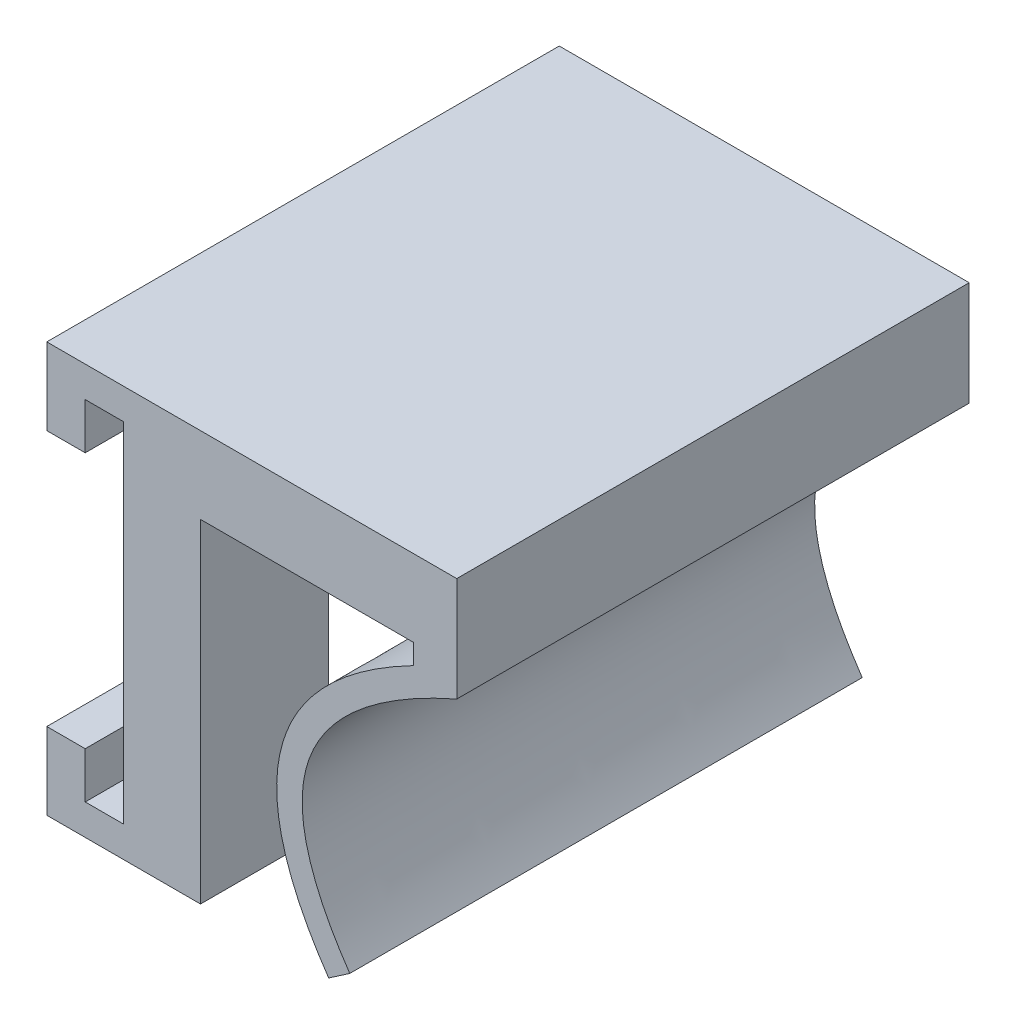
ISO-10303-21;
HEADER;
FILE_DESCRIPTION(('STEP AP214'),'2;1');
FILE_NAME('part.step','',(''),(''),'','','');
FILE_SCHEMA(('AUTOMOTIVE_DESIGN { 1 0 10303 214 1 1 1 1 }'));
ENDSEC;
DATA;
#1=APPLICATION_CONTEXT('core data for automotive mechanical design processes');
#2=APPLICATION_PROTOCOL_DEFINITION('international standard','automotive_design',2000,#1);
#3=PRODUCT_CONTEXT('',#1,'mechanical');
#4=PRODUCT('Part','Part','',(#3));
#5=PRODUCT_RELATED_PRODUCT_CATEGORY('part','',(#4));
#6=PRODUCT_DEFINITION_FORMATION('','',#4);
#7=PRODUCT_DEFINITION_CONTEXT('part definition',#1,'design');
#8=PRODUCT_DEFINITION('design','',#6,#7);
#9=PRODUCT_DEFINITION_SHAPE('','',#8);
#10=(LENGTH_UNIT() NAMED_UNIT(*) SI_UNIT(.MILLI.,.METRE.));
#11=(NAMED_UNIT(*) PLANE_ANGLE_UNIT() SI_UNIT($,.RADIAN.));
#12=(NAMED_UNIT(*) SI_UNIT($,.STERADIAN.) SOLID_ANGLE_UNIT());
#13=UNCERTAINTY_MEASURE_WITH_UNIT(LENGTH_MEASURE(1.E-05),#10,'distance_accuracy_value','');
#14=(GEOMETRIC_REPRESENTATION_CONTEXT(3) GLOBAL_UNCERTAINTY_ASSIGNED_CONTEXT((#13)) GLOBAL_UNIT_ASSIGNED_CONTEXT((#10,
#11,#12)) REPRESENTATION_CONTEXT('',''));
#15=CARTESIAN_POINT('',(0.,0.,0.));
#16=DIRECTION('',(0.,0.,1.));
#17=DIRECTION('',(1.,0.,0.));
#18=AXIS2_PLACEMENT_3D('',#15,#16,#17);
#19=CARTESIAN_POINT('',(0.,-8.,20.));
#20=DIRECTION('',(0.,1.,0.));
#21=DIRECTION('',(0.,0.,1.));
#22=AXIS2_PLACEMENT_3D('',#19,#20,#21);
#23=PLANE('',#22);
#24=DIRECTION('',(0.,0.,1.));
#25=VECTOR('',#24,1.);
#26=CARTESIAN_POINT('',(-4.5,-8.,0.));
#27=LINE('',#26,#25);
#28=CARTESIAN_POINT('',(-4.5,-8.,15.));
#29=VERTEX_POINT('',#28);
#30=CARTESIAN_POINT('',(-4.5,-8.,20.));
#31=VERTEX_POINT('',#30);
#32=EDGE_CURVE('E437',#29,#31,#27,.T.);
#33=ORIENTED_EDGE('',*,*,#32,.F.);
#34=DIRECTION('',(-1.,0.,0.));
#35=VECTOR('',#34,1.);
#36=CARTESIAN_POINT('',(1.5,-8.,15.));
#37=LINE('',#36,#35);
#38=CARTESIAN_POINT('',(1.5,-8.,15.));
#39=VERTEX_POINT('',#38);
#40=EDGE_CURVE('E239',#39,#29,#37,.T.);
#41=ORIENTED_EDGE('',*,*,#40,.F.);
#42=DIRECTION('',(0.,0.,-1.));
#43=VECTOR('',#42,1.);
#44=CARTESIAN_POINT('',(1.5,-8.,20.));
#45=LINE('',#44,#43);
#46=CARTESIAN_POINT('',(1.5,-8.,20.));
#47=VERTEX_POINT('',#46);
#48=EDGE_CURVE('E245',#47,#39,#45,.T.);
#49=ORIENTED_EDGE('',*,*,#48,.F.);
#50=DIRECTION('',(1.,0.,0.));
#51=VECTOR('',#50,1.);
#52=CARTESIAN_POINT('',(0.,-8.,20.));
#53=LINE('',#52,#51);
#54=EDGE_CURVE('E306',#31,#47,#53,.T.);
#55=ORIENTED_EDGE('',*,*,#54,.F.);
#56=EDGE_LOOP('',(#33,#41,#49,#55));
#57=FACE_BOUND('',#56,.T.);
#58=ADVANCED_FACE('F35',(#57),#23,.F.);
#59=CARTESIAN_POINT('',(1.5,0.,20.));
#60=DIRECTION('',(-1.,0.,0.));
#61=DIRECTION('',(0.,-1.,0.));
#62=AXIS2_PLACEMENT_3D('',#59,#60,#61);
#63=PLANE('',#62);
#64=ORIENTED_EDGE('',*,*,#48,.T.);
#65=DIRECTION('',(0.,1.,0.));
#66=VECTOR('',#65,1.);
#67=CARTESIAN_POINT('',(1.5,0.,15.));
#68=LINE('',#67,#66);
#69=CARTESIAN_POINT('',(1.5,5.,15.));
#70=VERTEX_POINT('',#69);
#71=EDGE_CURVE('E228',#39,#70,#68,.T.);
#72=ORIENTED_EDGE('',*,*,#71,.T.);
#73=DIRECTION('',(0.,0.,-1.));
#74=VECTOR('',#73,1.);
#75=CARTESIAN_POINT('',(1.5,5.,20.));
#76=LINE('',#75,#74);
#77=CARTESIAN_POINT('',(1.5,5.,20.));
#78=VERTEX_POINT('',#77);
#79=EDGE_CURVE('E246',#78,#70,#76,.T.);
#80=ORIENTED_EDGE('',*,*,#79,.F.);
#81=DIRECTION('',(0.,1.,0.));
#82=VECTOR('',#81,1.);
#83=CARTESIAN_POINT('',(1.5,0.,20.));
#84=LINE('',#83,#82);
#85=EDGE_CURVE('E301',#47,#78,#84,.T.);
#86=ORIENTED_EDGE('',*,*,#85,.F.);
#87=EDGE_LOOP('',(#64,#72,#80,#86));
#88=FACE_BOUND('',#87,.T.);
#89=ADVANCED_FACE('F554',(#88),#63,.F.);
#90=CARTESIAN_POINT('',(-4.5,-5.,0.));
#91=DIRECTION('',(0.,-1.,0.));
#92=DIRECTION('',(0.,0.,-1.));
#93=AXIS2_PLACEMENT_3D('',#90,#91,#92);
#94=PLANE('',#93);
#95=DIRECTION('',(0.,0.,1.));
#96=VECTOR('',#95,1.);
#97=CARTESIAN_POINT('',(-3.,-5.,20.));
#98=LINE('',#97,#96);
#99=CARTESIAN_POINT('',(-3.,-5.,15.));
#100=VERTEX_POINT('',#99);
#101=CARTESIAN_POINT('',(-3.,-5.,20.));
#102=VERTEX_POINT('',#101);
#103=EDGE_CURVE('E502',#100,#102,#98,.T.);
#104=ORIENTED_EDGE('',*,*,#103,.F.);
#105=DIRECTION('',(-1.,0.,0.));
#106=VECTOR('',#105,1.);
#107=CARTESIAN_POINT('',(1.5,-5.,15.));
#108=LINE('',#107,#106);
#109=CARTESIAN_POINT('',(-4.5,-5.,15.));
#110=VERTEX_POINT('',#109);
#111=EDGE_CURVE('E511',#100,#110,#108,.T.);
#112=ORIENTED_EDGE('',*,*,#111,.T.);
#113=DIRECTION('',(0.,0.,-1.));
#114=VECTOR('',#113,1.);
#115=CARTESIAN_POINT('',(-4.5,-5.,0.));
#116=LINE('',#115,#114);
#117=CARTESIAN_POINT('',(-4.5,-5.,20.));
#118=VERTEX_POINT('',#117);
#119=EDGE_CURVE('E443',#118,#110,#116,.T.);
#120=ORIENTED_EDGE('',*,*,#119,.F.);
#121=DIRECTION('',(1.,0.,0.));
#122=VECTOR('',#121,1.);
#123=CARTESIAN_POINT('',(-4.5,-5.,20.));
#124=LINE('',#123,#122);
#125=EDGE_CURVE('E449',#118,#102,#124,.T.);
#126=ORIENTED_EDGE('',*,*,#125,.T.);
#127=EDGE_LOOP('',(#104,#112,#120,#126));
#128=FACE_BOUND('',#127,.T.);
#129=ADVANCED_FACE('F560',(#128),#94,.F.);
#130=CARTESIAN_POINT('',(-4.5,0.,0.));
#131=DIRECTION('',(1.,0.,0.));
#132=DIRECTION('',(0.,0.,-1.));
#133=AXIS2_PLACEMENT_3D('',#130,#131,#132);
#134=PLANE('',#133);
#135=ORIENTED_EDGE('',*,*,#119,.T.);
#136=DIRECTION('',(0.,1.,0.));
#137=VECTOR('',#136,1.);
#138=CARTESIAN_POINT('',(-4.5,-8.,15.));
#139=LINE('',#138,#137);
#140=EDGE_CURVE('E512',#29,#110,#139,.T.);
#141=ORIENTED_EDGE('',*,*,#140,.F.);
#142=ORIENTED_EDGE('',*,*,#32,.T.);
#143=DIRECTION('',(0.,1.,0.));
#144=VECTOR('',#143,1.);
#145=CARTESIAN_POINT('',(-4.5,-8.,20.));
#146=LINE('',#145,#144);
#147=EDGE_CURVE('E440',#31,#118,#146,.T.);
#148=ORIENTED_EDGE('',*,*,#147,.T.);
#149=EDGE_LOOP('',(#135,#141,#142,#148));
#150=FACE_BOUND('',#149,.T.);
#151=ADVANCED_FACE('F552',(#150),#134,.F.);
#152=CARTESIAN_POINT('',(-3.,-6.8,20.));
#153=DIRECTION('',(-1.,0.,0.));
#154=DIRECTION('',(0.,0.,1.));
#155=AXIS2_PLACEMENT_3D('',#152,#153,#154);
#156=PLANE('',#155);
#157=DIRECTION('',(0.,0.,1.));
#158=VECTOR('',#157,1.);
#159=CARTESIAN_POINT('',(-3.,-6.8,20.));
#160=LINE('',#159,#158);
#161=CARTESIAN_POINT('',(-3.,-6.8,15.));
#162=VERTEX_POINT('',#161);
#163=CARTESIAN_POINT('',(-3.,-6.8,20.));
#164=VERTEX_POINT('',#163);
#165=EDGE_CURVE('E493',#162,#164,#160,.T.);
#166=ORIENTED_EDGE('',*,*,#165,.F.);
#167=DIRECTION('',(0.,1.,0.));
#168=VECTOR('',#167,1.);
#169=CARTESIAN_POINT('',(-3.,-6.8,15.));
#170=LINE('',#169,#168);
#171=EDGE_CURVE('E487',#162,#100,#170,.T.);
#172=ORIENTED_EDGE('',*,*,#171,.T.);
#173=ORIENTED_EDGE('',*,*,#103,.T.);
#174=DIRECTION('',(0.,1.,0.));
#175=VECTOR('',#174,1.);
#176=CARTESIAN_POINT('',(-3.,-6.8,20.));
#177=LINE('',#176,#175);
#178=EDGE_CURVE('E429',#164,#102,#177,.T.);
#179=ORIENTED_EDGE('',*,*,#178,.F.);
#180=EDGE_LOOP('',(#166,#172,#173,#179));
#181=FACE_BOUND('',#180,.T.);
#182=ADVANCED_FACE('F582',(#181),#156,.F.);
#183=CARTESIAN_POINT('',(0.,-6.8,0.));
#184=DIRECTION('',(0.,1.,0.));
#185=DIRECTION('',(0.,0.,1.));
#186=AXIS2_PLACEMENT_3D('',#183,#184,#185);
#187=PLANE('',#186);
#188=DIRECTION('',(1.,0.,0.));
#189=VECTOR('',#188,1.);
#190=CARTESIAN_POINT('',(0.,-6.8,15.));
#191=LINE('',#190,#189);
#192=CARTESIAN_POINT('',(-1.5,-6.8,15.));
#193=VERTEX_POINT('',#192);
#194=EDGE_CURVE('E11',#162,#193,#191,.T.);
#195=ORIENTED_EDGE('',*,*,#194,.F.);
#196=ORIENTED_EDGE('',*,*,#165,.T.);
#197=DIRECTION('',(1.,0.,0.));
#198=VECTOR('',#197,1.);
#199=CARTESIAN_POINT('',(-1.5,-6.8,20.));
#200=LINE('',#199,#198);
#201=CARTESIAN_POINT('',(-1.5,-6.8,20.));
#202=VERTEX_POINT('',#201);
#203=EDGE_CURVE('E492',#164,#202,#200,.T.);
#204=ORIENTED_EDGE('',*,*,#203,.T.);
#205=DIRECTION('',(0.,0.,-1.));
#206=VECTOR('',#205,1.);
#207=CARTESIAN_POINT('',(-1.5,-6.8,20.));
#208=LINE('',#207,#206);
#209=EDGE_CURVE('E406',#202,#193,#208,.T.);
#210=ORIENTED_EDGE('',*,*,#209,.T.);
#211=EDGE_LOOP('',(#195,#196,#204,#210));
#212=FACE_BOUND('',#211,.T.);
#213=ADVANCED_FACE('F578',(#212),#187,.T.);
#214=CARTESIAN_POINT('',(-1.5,0.,20.));
#215=DIRECTION('',(-1.,0.,0.));
#216=DIRECTION('',(0.,0.,1.));
#217=AXIS2_PLACEMENT_3D('',#214,#215,#216);
#218=PLANE('',#217);
#219=DIRECTION('',(0.,1.,0.));
#220=VECTOR('',#219,1.);
#221=CARTESIAN_POINT('',(-1.5,6.8,15.));
#222=LINE('',#221,#220);
#223=CARTESIAN_POINT('',(-1.5,6.8,15.));
#224=VERTEX_POINT('',#223);
#225=EDGE_CURVE('E522',#193,#224,#222,.T.);
#226=ORIENTED_EDGE('',*,*,#225,.F.);
#227=ORIENTED_EDGE('',*,*,#209,.F.);
#228=DIRECTION('',(0.,1.,0.));
#229=VECTOR('',#228,1.);
#230=CARTESIAN_POINT('',(-1.5,0.,20.));
#231=LINE('',#230,#229);
#232=CARTESIAN_POINT('',(-1.5,6.8,20.));
#233=VERTEX_POINT('',#232);
#234=EDGE_CURVE('E281',#202,#233,#231,.T.);
#235=ORIENTED_EDGE('',*,*,#234,.T.);
#236=DIRECTION('',(0.,0.,1.));
#237=VECTOR('',#236,1.);
#238=CARTESIAN_POINT('',(-1.5,6.8,0.));
#239=LINE('',#238,#237);
#240=EDGE_CURVE('E404',#224,#233,#239,.T.);
#241=ORIENTED_EDGE('',*,*,#240,.F.);
#242=EDGE_LOOP('',(#226,#227,#235,#241));
#243=FACE_BOUND('',#242,.T.);
#244=ADVANCED_FACE('F403',(#243),#218,.T.);
#245=DIRECTION('',(0.,-1.,0.));
#246=VECTOR('',#245,1.);
#247=CARTESIAN_POINT('',(-1.5,6.8,5.));
#248=LINE('',#247,#246);
#249=CARTESIAN_POINT('',(-1.5,6.8,5.));
#250=VERTEX_POINT('',#249);
#251=CARTESIAN_POINT('',(-1.5,-6.8,5.));
#252=VERTEX_POINT('',#251);
#253=EDGE_CURVE('E58',#250,#252,#248,.T.);
#254=ORIENTED_EDGE('',*,*,#253,.F.);
#255=CARTESIAN_POINT('',(-1.5,6.8,0.));
#256=VERTEX_POINT('',#255);
#257=EDGE_CURVE('E417',#256,#250,#239,.T.);
#258=ORIENTED_EDGE('',*,*,#257,.F.);
#259=DIRECTION('',(0.,1.,0.));
#260=VECTOR('',#259,1.);
#261=CARTESIAN_POINT('',(-1.5,0.,0.));
#262=LINE('',#261,#260);
#263=CARTESIAN_POINT('',(-1.5,-6.8,0.));
#264=VERTEX_POINT('',#263);
#265=EDGE_CURVE('E277',#264,#256,#262,.T.);
#266=ORIENTED_EDGE('',*,*,#265,.F.);
#267=EDGE_CURVE('E501',#252,#264,#208,.T.);
#268=ORIENTED_EDGE('',*,*,#267,.F.);
#269=EDGE_LOOP('',(#254,#258,#266,#268));
#270=FACE_BOUND('',#269,.T.);
#271=ADVANCED_FACE('F539',(#270),#218,.T.);
#272=CARTESIAN_POINT('',(9.80833226723371,0.,20.));
#273=DIRECTION('',(1.,0.,0.));
#274=DIRECTION('',(0.,0.,-1.));
#275=AXIS2_PLACEMENT_3D('',#272,#273,#274);
#276=PLANE('',#275);
#277=DIRECTION('',(0.,-1.,0.));
#278=VECTOR('',#277,1.);
#279=CARTESIAN_POINT('',(9.80833226723371,0.,0.));
#280=LINE('',#279,#278);
#281=CARTESIAN_POINT('',(9.80833226723371,5.,0.));
#282=VERTEX_POINT('',#281);
#283=CARTESIAN_POINT('',(9.80833226723382,4.21257436758586,0.));
#284=VERTEX_POINT('',#283);
#285=EDGE_CURVE('E274',#282,#284,#280,.T.);
#286=ORIENTED_EDGE('',*,*,#285,.T.);
#287=DIRECTION('',(0.,0.,-1.));
#288=VECTOR('',#287,1.);
#289=CARTESIAN_POINT('',(9.80833226723382,4.21257436758586,20.));
#290=LINE('',#289,#288);
#291=CARTESIAN_POINT('',(9.80833226723382,4.21257436758586,20.));
#292=VERTEX_POINT('',#291);
#293=EDGE_CURVE('E261',#292,#284,#290,.T.);
#294=ORIENTED_EDGE('',*,*,#293,.F.);
#295=DIRECTION('',(0.,-1.,0.));
#296=VECTOR('',#295,1.);
#297=CARTESIAN_POINT('',(9.80833226723371,0.,20.));
#298=LINE('',#297,#296);
#299=CARTESIAN_POINT('',(9.80833226723371,5.,20.));
#300=VERTEX_POINT('',#299);
#301=EDGE_CURVE('E292',#300,#292,#298,.T.);
#302=ORIENTED_EDGE('',*,*,#301,.F.);
#303=DIRECTION('',(0.,0.,-1.));
#304=VECTOR('',#303,1.);
#305=CARTESIAN_POINT('',(9.80833226723371,5.,20.));
#306=LINE('',#305,#304);
#307=EDGE_CURVE('E293',#300,#282,#306,.T.);
#308=ORIENTED_EDGE('',*,*,#307,.T.);
#309=EDGE_LOOP('',(#286,#294,#302,#308));
#310=FACE_BOUND('',#309,.T.);
#311=ADVANCED_FACE('F37',(#310),#276,.F.);
#312=CARTESIAN_POINT('',(11.5,5.,20.));
#313=CARTESIAN_POINT('',(0.69868443825036,0.459674775249766,20.));
#314=CARTESIAN_POINT('',(6.5,-8.,20.));
#315=B_SPLINE_CURVE_WITH_KNOTS('',2,(#312,#313,#314),.UNSPECIFIED.,.F.,.F.,(3,3),(0.,1.),.UNSPECIFIED.);
#316=DIRECTION('',(0.,0.,-1.));
#317=VECTOR('',#316,1.);
#318=SURFACE_OF_LINEAR_EXTRUSION('',#315,#317);
#319=CARTESIAN_POINT('',(11.5,5.,0.));
#320=CARTESIAN_POINT('',(0.69868443825036,0.459674775249766,0.));
#321=CARTESIAN_POINT('',(6.5,-8.,0.));
#322=B_SPLINE_CURVE_WITH_KNOTS('',2,(#319,#320,#321),.UNSPECIFIED.,.F.,.F.,(3,3),(0.,1.),.UNSPECIFIED.);
#323=CARTESIAN_POINT('',(6.5,-8.,0.));
#324=VERTEX_POINT('',#323);
#325=EDGE_CURVE('E311',#284,#324,#322,.T.);
#326=ORIENTED_EDGE('',*,*,#325,.T.);
#327=DIRECTION('',(0.,0.,-1.));
#328=VECTOR('',#327,1.);
#329=CARTESIAN_POINT('',(6.5,-8.,20.));
#330=LINE('',#329,#328);
#331=CARTESIAN_POINT('',(6.5,-8.,20.));
#332=VERTEX_POINT('',#331);
#333=EDGE_CURVE('E259',#332,#324,#330,.T.);
#334=ORIENTED_EDGE('',*,*,#333,.F.);
#335=EDGE_CURVE('E356',#292,#332,#315,.T.);
#336=ORIENTED_EDGE('',*,*,#335,.F.);
#337=ORIENTED_EDGE('',*,*,#293,.T.);
#338=EDGE_LOOP('',(#326,#334,#336,#337));
#339=FACE_BOUND('',#338,.T.);
#340=ADVANCED_FACE('F366',(#339),#318,.F.);
#341=CARTESIAN_POINT('',(5.81039012029658,-8.4729076037727,20.));
#342=DIRECTION('',(0.565554594664252,-0.824710858697855,0.));
#343=DIRECTION('',(0.824710858697855,0.565554594664252,0.));
#344=AXIS2_PLACEMENT_3D('',#341,#342,#343);
#345=PLANE('',#344);
#346=DIRECTION('',(-0.824710858697855,-0.565554594664252,0.));
#347=VECTOR('',#346,1.);
#348=CARTESIAN_POINT('',(5.81039012029658,-8.4729076037727,0.));
#349=LINE('',#348,#347);
#350=CARTESIAN_POINT('',(7.32471085869786,-7.43444540533575,0.));
#351=VERTEX_POINT('',#350);
#352=EDGE_CURVE('E316',#351,#324,#349,.T.);
#353=ORIENTED_EDGE('',*,*,#352,.F.);
#354=DIRECTION('',(0.,0.,-1.));
#355=VECTOR('',#354,1.);
#356=CARTESIAN_POINT('',(7.32471085869786,-7.43444540533575,20.));
#357=LINE('',#356,#355);
#358=CARTESIAN_POINT('',(7.32471085869786,-7.43444540533575,20.));
#359=VERTEX_POINT('',#358);
#360=EDGE_CURVE('E257',#359,#351,#357,.T.);
#361=ORIENTED_EDGE('',*,*,#360,.F.);
#362=DIRECTION('',(-0.824710858697855,-0.565554594664252,0.));
#363=VECTOR('',#362,1.);
#364=CARTESIAN_POINT('',(5.81039012029658,-8.4729076037727,20.));
#365=LINE('',#364,#363);
#366=EDGE_CURVE('E361',#359,#332,#365,.T.);
#367=ORIENTED_EDGE('',*,*,#366,.T.);
#368=ORIENTED_EDGE('',*,*,#333,.T.);
#369=EDGE_LOOP('',(#353,#361,#367,#368));
#370=FACE_BOUND('',#369,.T.);
#371=ADVANCED_FACE('F369',(#370),#345,.T.);
#372=CARTESIAN_POINT('',(11.8814826817081,4.09276890011634,20.));
#373=CARTESIAN_POINT('',(11.4653347452535,3.91740699397234,20.));
#374=CARTESIAN_POINT('',(10.6173648153041,3.53267663889554,20.));
#375=CARTESIAN_POINT('',(9.16750818410709,2.75961685229649,20.));
#376=CARTESIAN_POINT('',(7.67601491356282,1.73269565358223,20.));
#377=CARTESIAN_POINT('',(6.43799543916673,0.449518828254966,20.));
#378=CARTESIAN_POINT('',(5.70227672063804,-0.864348188978457,20.));
#379=CARTESIAN_POINT('',(5.4056047654477,-2.23902290966888,20.));
#380=CARTESIAN_POINT('',(5.52912384514838,-3.76313841554845,20.));
#381=CARTESIAN_POINT('',(6.02999477564439,-5.20655577151254,20.));
#382=CARTESIAN_POINT('',(6.67695899363608,-6.44166618770648,20.));
#383=CARTESIAN_POINT('',(7.10589628264903,-7.11596848493027,20.));
#384=CARTESIAN_POINT('',(7.32471085869783,-7.43444540533569,20.));
#385=B_SPLINE_CURVE_WITH_KNOTS('',3,(#372,#373,#374,#375,#376,#377,#378,#379,#380,#381,#382,
#383,#384),.UNSPECIFIED.,.F.,.F.,(4,1,1,1,1,1,1,1,1,1,4),(0.,0.0625,0.125,0.25,0.375,0.5,0.625,
0.75,0.875,0.9375,1.),.UNSPECIFIED.);
#386=DIRECTION('',(0.,0.,-1.));
#387=VECTOR('',#386,1.);
#388=SURFACE_OF_LINEAR_EXTRUSION('',#385,#387);
#389=CARTESIAN_POINT('',(11.8814826817081,4.09276890011634,0.));
#390=CARTESIAN_POINT('',(11.4653347452535,3.91740699397234,0.));
#391=CARTESIAN_POINT('',(10.6173648153041,3.53267663889554,0.));
#392=CARTESIAN_POINT('',(9.16750818410709,2.75961685229649,0.));
#393=CARTESIAN_POINT('',(7.67601491356282,1.73269565358223,0.));
#394=CARTESIAN_POINT('',(6.43799543916673,0.449518828254966,0.));
#395=CARTESIAN_POINT('',(5.70227672063804,-0.864348188978457,0.));
#396=CARTESIAN_POINT('',(5.4056047654477,-2.23902290966888,0.));
#397=CARTESIAN_POINT('',(5.52912384514838,-3.76313841554845,0.));
#398=CARTESIAN_POINT('',(6.02999477564439,-5.20655577151254,0.));
#399=CARTESIAN_POINT('',(6.67695899363608,-6.44166618770648,0.));
#400=CARTESIAN_POINT('',(7.10589628264903,-7.11596848493027,0.));
#401=CARTESIAN_POINT('',(7.32471085869783,-7.43444540533569,0.));
#402=B_SPLINE_CURVE_WITH_KNOTS('',3,(#389,#390,#391,#392,#393,#394,#395,#396,#397,#398,#399,
#400,#401),.UNSPECIFIED.,.F.,.F.,(4,1,1,1,1,1,1,1,1,1,4),(0.,0.0625,0.125,0.25,0.375,0.5,0.625,
0.75,0.875,0.9375,1.),.UNSPECIFIED.);
#403=CARTESIAN_POINT('',(11.5,3.92820701117085,0.));
#404=VERTEX_POINT('',#403);
#405=EDGE_CURVE('E322',#404,#351,#402,.T.);
#406=ORIENTED_EDGE('',*,*,#405,.F.);
#407=DIRECTION('',(0.,0.,-1.));
#408=VECTOR('',#407,1.);
#409=CARTESIAN_POINT('',(11.5,3.92820701117085,20.));
#410=LINE('',#409,#408);
#411=CARTESIAN_POINT('',(11.5,3.92820701117085,20.));
#412=VERTEX_POINT('',#411);
#413=EDGE_CURVE('E255',#412,#404,#410,.T.);
#414=ORIENTED_EDGE('',*,*,#413,.F.);
#415=EDGE_CURVE('E380',#412,#359,#385,.T.);
#416=ORIENTED_EDGE('',*,*,#415,.T.);
#417=ORIENTED_EDGE('',*,*,#360,.T.);
#418=EDGE_LOOP('',(#406,#414,#416,#417));
#419=FACE_BOUND('',#418,.T.);
#420=ADVANCED_FACE('F373',(#419),#388,.T.);
#421=CARTESIAN_POINT('',(11.5,0.,20.));
#422=DIRECTION('',(1.,0.,0.));
#423=DIRECTION('',(0.,1.,0.));
#424=AXIS2_PLACEMENT_3D('',#421,#422,#423);
#425=PLANE('',#424);
#426=DIRECTION('',(0.,-1.,0.));
#427=VECTOR('',#426,1.);
#428=CARTESIAN_POINT('',(11.5,0.,0.));
#429=LINE('',#428,#427);
#430=CARTESIAN_POINT('',(11.5,8.,0.));
#431=VERTEX_POINT('',#430);
#432=EDGE_CURVE('E326',#431,#404,#429,.T.);
#433=ORIENTED_EDGE('',*,*,#432,.F.);
#434=DIRECTION('',(0.,0.,-1.));
#435=VECTOR('',#434,1.);
#436=CARTESIAN_POINT('',(11.5,8.,20.));
#437=LINE('',#436,#435);
#438=CARTESIAN_POINT('',(11.5,8.,20.));
#439=VERTEX_POINT('',#438);
#440=EDGE_CURVE('E249',#439,#431,#437,.T.);
#441=ORIENTED_EDGE('',*,*,#440,.F.);
#442=DIRECTION('',(0.,-1.,0.));
#443=VECTOR('',#442,1.);
#444=CARTESIAN_POINT('',(11.5,0.,20.));
#445=LINE('',#444,#443);
#446=EDGE_CURVE('E386',#439,#412,#445,.T.);
#447=ORIENTED_EDGE('',*,*,#446,.T.);
#448=ORIENTED_EDGE('',*,*,#413,.T.);
#449=EDGE_LOOP('',(#433,#441,#447,#448));
#450=FACE_BOUND('',#449,.T.);
#451=ADVANCED_FACE('F377',(#450),#425,.T.);
#452=CARTESIAN_POINT('',(0.,8.,20.));
#453=DIRECTION('',(0.,1.,0.));
#454=DIRECTION('',(0.,0.,1.));
#455=AXIS2_PLACEMENT_3D('',#452,#453,#454);
#456=PLANE('',#455);
#457=DIRECTION('',(1.,0.,0.));
#458=VECTOR('',#457,1.);
#459=CARTESIAN_POINT('',(0.,8.,0.));
#460=LINE('',#459,#458);
#461=CARTESIAN_POINT('',(-4.5,8.,0.));
#462=VERTEX_POINT('',#461);
#463=EDGE_CURVE('E280',#462,#431,#460,.T.);
#464=ORIENTED_EDGE('',*,*,#463,.F.);
#465=DIRECTION('',(0.,0.,-1.));
#466=VECTOR('',#465,1.);
#467=CARTESIAN_POINT('',(-4.5,8.,0.));
#468=LINE('',#467,#466);
#469=CARTESIAN_POINT('',(-4.5,8.,20.));
#470=VERTEX_POINT('',#469);
#471=EDGE_CURVE('E269',#470,#462,#468,.T.);
#472=ORIENTED_EDGE('',*,*,#471,.F.);
#473=DIRECTION('',(1.,0.,0.));
#474=VECTOR('',#473,1.);
#475=CARTESIAN_POINT('',(0.,8.,20.));
#476=LINE('',#475,#474);
#477=EDGE_CURVE('E392',#470,#439,#476,.T.);
#478=ORIENTED_EDGE('',*,*,#477,.T.);
#479=ORIENTED_EDGE('',*,*,#440,.T.);
#480=EDGE_LOOP('',(#464,#472,#478,#479));
#481=FACE_BOUND('',#480,.T.);
#482=ADVANCED_FACE('F343',(#481),#456,.T.);
#483=CARTESIAN_POINT('',(1.5,-8.,5.));
#484=VERTEX_POINT('',#483);
#485=CARTESIAN_POINT('',(1.5,-8.,0.));
#486=VERTEX_POINT('',#485);
#487=EDGE_CURVE('E224',#484,#486,#45,.T.);
#488=ORIENTED_EDGE('',*,*,#487,.F.);
#489=DIRECTION('',(-1.,0.,0.));
#490=VECTOR('',#489,1.);
#491=CARTESIAN_POINT('',(1.5,-8.,5.));
#492=LINE('',#491,#490);
#493=CARTESIAN_POINT('',(-4.5,-8.,5.));
#494=VERTEX_POINT('',#493);
#495=EDGE_CURVE('E232',#484,#494,#492,.T.);
#496=ORIENTED_EDGE('',*,*,#495,.T.);
#497=CARTESIAN_POINT('',(-4.5,-8.,0.));
#498=VERTEX_POINT('',#497);
#499=EDGE_CURVE('E438',#498,#494,#27,.T.);
#500=ORIENTED_EDGE('',*,*,#499,.F.);
#501=DIRECTION('',(1.,0.,0.));
#502=VECTOR('',#501,1.);
#503=CARTESIAN_POINT('',(0.,-8.,0.));
#504=LINE('',#503,#502);
#505=EDGE_CURVE('E243',#498,#486,#504,.T.);
#506=ORIENTED_EDGE('',*,*,#505,.T.);
#507=EDGE_LOOP('',(#488,#496,#500,#506));
#508=FACE_BOUND('',#507,.T.);
#509=ADVANCED_FACE('F242',(#508),#23,.F.);
#510=DIRECTION('',(0.,-1.,0.));
#511=VECTOR('',#510,1.);
#512=CARTESIAN_POINT('',(1.5,0.,5.));
#513=LINE('',#512,#511);
#514=CARTESIAN_POINT('',(1.5,5.,5.));
#515=VERTEX_POINT('',#514);
#516=EDGE_CURVE('E219',#515,#484,#513,.T.);
#517=ORIENTED_EDGE('',*,*,#516,.T.);
#518=ORIENTED_EDGE('',*,*,#487,.T.);
#519=DIRECTION('',(0.,1.,0.));
#520=VECTOR('',#519,1.);
#521=CARTESIAN_POINT('',(1.5,0.,0.));
#522=LINE('',#521,#520);
#523=CARTESIAN_POINT('',(1.5,5.,0.));
#524=VERTEX_POINT('',#523);
#525=EDGE_CURVE('E289',#486,#524,#522,.T.);
#526=ORIENTED_EDGE('',*,*,#525,.T.);
#527=EDGE_CURVE('E226',#515,#524,#76,.T.);
#528=ORIENTED_EDGE('',*,*,#527,.F.);
#529=EDGE_LOOP('',(#517,#518,#526,#528));
#530=FACE_BOUND('',#529,.T.);
#531=ADVANCED_FACE('F221',(#530),#63,.F.);
#532=CARTESIAN_POINT('',(0.,5.,20.));
#533=DIRECTION('',(0.,1.,0.));
#534=DIRECTION('',(0.,0.,1.));
#535=AXIS2_PLACEMENT_3D('',#532,#533,#534);
#536=PLANE('',#535);
#537=ORIENTED_EDGE('',*,*,#79,.T.);
#538=DIRECTION('',(1.,0.,0.));
#539=VECTOR('',#538,1.);
#540=CARTESIAN_POINT('',(0.,5.,15.));
#541=LINE('',#540,#539);
#542=CARTESIAN_POINT('',(2.5,5.,15.));
#543=VERTEX_POINT('',#542);
#544=EDGE_CURVE('E471',#70,#543,#541,.T.);
#545=ORIENTED_EDGE('',*,*,#544,.T.);
#546=DIRECTION('',(0.,0.,-1.));
#547=VECTOR('',#546,1.);
#548=CARTESIAN_POINT('',(2.5,5.,20.));
#549=LINE('',#548,#547);
#550=CARTESIAN_POINT('',(2.5,5.,5.));
#551=VERTEX_POINT('',#550);
#552=EDGE_CURVE('E264',#543,#551,#549,.T.);
#553=ORIENTED_EDGE('',*,*,#552,.T.);
#554=DIRECTION('',(-1.,0.,0.));
#555=VECTOR('',#554,1.);
#556=CARTESIAN_POINT('',(0.,5.,5.));
#557=LINE('',#556,#555);
#558=EDGE_CURVE('E469',#551,#515,#557,.T.);
#559=ORIENTED_EDGE('',*,*,#558,.T.);
#560=ORIENTED_EDGE('',*,*,#527,.T.);
#561=DIRECTION('',(1.,0.,0.));
#562=VECTOR('',#561,1.);
#563=CARTESIAN_POINT('',(0.,5.,0.));
#564=LINE('',#563,#562);
#565=EDGE_CURVE('E291',#524,#282,#564,.T.);
#566=ORIENTED_EDGE('',*,*,#565,.T.);
#567=ORIENTED_EDGE('',*,*,#307,.F.);
#568=DIRECTION('',(1.,0.,0.));
#569=VECTOR('',#568,1.);
#570=CARTESIAN_POINT('',(0.,5.,20.));
#571=LINE('',#570,#569);
#572=EDGE_CURVE('E295',#78,#300,#571,.T.);
#573=ORIENTED_EDGE('',*,*,#572,.F.);
#574=EDGE_LOOP('',(#537,#545,#553,#559,#560,#566,#567,#573));
#575=FACE_BOUND('',#574,.T.);
#576=ADVANCED_FACE('F467',(#575),#536,.F.);
#577=CARTESIAN_POINT('',(0.,0.,20.));
#578=DIRECTION('',(0.,0.,1.));
#579=DIRECTION('',(1.,0.,0.));
#580=AXIS2_PLACEMENT_3D('',#577,#578,#579);
#581=PLANE('',#580);
#582=ORIENTED_EDGE('',*,*,#234,.F.);
#583=ORIENTED_EDGE('',*,*,#203,.F.);
#584=ORIENTED_EDGE('',*,*,#178,.T.);
#585=ORIENTED_EDGE('',*,*,#125,.F.);
#586=ORIENTED_EDGE('',*,*,#147,.F.);
#587=ORIENTED_EDGE('',*,*,#54,.T.);
#588=ORIENTED_EDGE('',*,*,#85,.T.);
#589=ORIENTED_EDGE('',*,*,#572,.T.);
#590=ORIENTED_EDGE('',*,*,#301,.T.);
#591=ORIENTED_EDGE('',*,*,#335,.T.);
#592=ORIENTED_EDGE('',*,*,#366,.F.);
#593=ORIENTED_EDGE('',*,*,#415,.F.);
#594=ORIENTED_EDGE('',*,*,#446,.F.);
#595=ORIENTED_EDGE('',*,*,#477,.F.);
#596=DIRECTION('',(0.,1.,0.));
#597=VECTOR('',#596,1.);
#598=CARTESIAN_POINT('',(-4.5,8.,20.));
#599=LINE('',#598,#597);
#600=CARTESIAN_POINT('',(-4.5,5.,20.));
#601=VERTEX_POINT('',#600);
#602=EDGE_CURVE('E349',#601,#470,#599,.T.);
#603=ORIENTED_EDGE('',*,*,#602,.F.);
#604=DIRECTION('',(1.,0.,0.));
#605=VECTOR('',#604,1.);
#606=CARTESIAN_POINT('',(-4.5,5.,20.));
#607=LINE('',#606,#605);
#608=CARTESIAN_POINT('',(-3.,5.,20.));
#609=VERTEX_POINT('',#608);
#610=EDGE_CURVE('E265',#601,#609,#607,.T.);
#611=ORIENTED_EDGE('',*,*,#610,.T.);
#612=DIRECTION('',(0.,-1.,0.));
#613=VECTOR('',#612,1.);
#614=CARTESIAN_POINT('',(-3.,6.8,20.));
#615=LINE('',#614,#613);
#616=CARTESIAN_POINT('',(-3.,6.8,20.));
#617=VERTEX_POINT('',#616);
#618=EDGE_CURVE('E413',#617,#609,#615,.T.);
#619=ORIENTED_EDGE('',*,*,#618,.F.);
#620=DIRECTION('',(-1.,0.,0.));
#621=VECTOR('',#620,1.);
#622=CARTESIAN_POINT('',(-1.5,6.8,20.));
#623=LINE('',#622,#621);
#624=EDGE_CURVE('E411',#233,#617,#623,.T.);
#625=ORIENTED_EDGE('',*,*,#624,.F.);
#626=EDGE_LOOP('',(#582,#583,#584,#585,#586,#587,#588,#589,#590,#591,#592,#593,#594,#595,#603,
#611,#619,#625));
#627=FACE_BOUND('',#626,.T.);
#628=ADVANCED_FACE('F412',(#627),#581,.T.);
#629=CARTESIAN_POINT('',(0.,0.,0.));
#630=DIRECTION('',(0.,0.,1.));
#631=DIRECTION('',(1.,0.,0.));
#632=AXIS2_PLACEMENT_3D('',#629,#630,#631);
#633=PLANE('',#632);
#634=DIRECTION('',(-1.,0.,0.));
#635=VECTOR('',#634,1.);
#636=CARTESIAN_POINT('',(-1.5,-6.8,0.));
#637=LINE('',#636,#635);
#638=CARTESIAN_POINT('',(-3.,-6.8,0.));
#639=VERTEX_POINT('',#638);
#640=EDGE_CURVE('E490',#264,#639,#637,.T.);
#641=ORIENTED_EDGE('',*,*,#640,.F.);
#642=ORIENTED_EDGE('',*,*,#265,.T.);
#643=DIRECTION('',(1.,0.,0.));
#644=VECTOR('',#643,1.);
#645=CARTESIAN_POINT('',(-1.5,6.8,0.));
#646=LINE('',#645,#644);
#647=CARTESIAN_POINT('',(-3.,6.8,0.));
#648=VERTEX_POINT('',#647);
#649=EDGE_CURVE('E419',#648,#256,#646,.T.);
#650=ORIENTED_EDGE('',*,*,#649,.F.);
#651=DIRECTION('',(0.,-1.,0.));
#652=VECTOR('',#651,1.);
#653=CARTESIAN_POINT('',(-3.,6.8,0.));
#654=LINE('',#653,#652);
#655=CARTESIAN_POINT('',(-3.,5.,0.));
#656=VERTEX_POINT('',#655);
#657=EDGE_CURVE('E430',#648,#656,#654,.T.);
#658=ORIENTED_EDGE('',*,*,#657,.T.);
#659=DIRECTION('',(1.,0.,0.));
#660=VECTOR('',#659,1.);
#661=CARTESIAN_POINT('',(-4.5,5.,0.));
#662=LINE('',#661,#660);
#663=CARTESIAN_POINT('',(-4.5,5.,0.));
#664=VERTEX_POINT('',#663);
#665=EDGE_CURVE('E268',#664,#656,#662,.T.);
#666=ORIENTED_EDGE('',*,*,#665,.F.);
#667=DIRECTION('',(0.,-1.,0.));
#668=VECTOR('',#667,1.);
#669=CARTESIAN_POINT('',(-4.5,8.,0.));
#670=LINE('',#669,#668);
#671=EDGE_CURVE('E339',#462,#664,#670,.T.);
#672=ORIENTED_EDGE('',*,*,#671,.F.);
#673=ORIENTED_EDGE('',*,*,#463,.T.);
#674=ORIENTED_EDGE('',*,*,#432,.T.);
#675=ORIENTED_EDGE('',*,*,#405,.T.);
#676=ORIENTED_EDGE('',*,*,#352,.T.);
#677=ORIENTED_EDGE('',*,*,#325,.F.);
#678=ORIENTED_EDGE('',*,*,#285,.F.);
#679=ORIENTED_EDGE('',*,*,#565,.F.);
#680=ORIENTED_EDGE('',*,*,#525,.F.);
#681=ORIENTED_EDGE('',*,*,#505,.F.);
#682=DIRECTION('',(0.,-1.,0.));
#683=VECTOR('',#682,1.);
#684=CARTESIAN_POINT('',(-4.5,-8.,0.));
#685=LINE('',#684,#683);
#686=CARTESIAN_POINT('',(-4.5,-5.,0.));
#687=VERTEX_POINT('',#686);
#688=EDGE_CURVE('E433',#687,#498,#685,.T.);
#689=ORIENTED_EDGE('',*,*,#688,.F.);
#690=DIRECTION('',(1.,0.,0.));
#691=VECTOR('',#690,1.);
#692=CARTESIAN_POINT('',(-4.5,-5.,0.));
#693=LINE('',#692,#691);
#694=CARTESIAN_POINT('',(-3.,-5.,0.));
#695=VERTEX_POINT('',#694);
#696=EDGE_CURVE('E446',#687,#695,#693,.T.);
#697=ORIENTED_EDGE('',*,*,#696,.T.);
#698=DIRECTION('',(0.,1.,0.));
#699=VECTOR('',#698,1.);
#700=CARTESIAN_POINT('',(-3.,-6.8,0.));
#701=LINE('',#700,#699);
#702=EDGE_CURVE('E495',#639,#695,#701,.T.);
#703=ORIENTED_EDGE('',*,*,#702,.F.);
#704=EDGE_LOOP('',(#641,#642,#650,#658,#666,#672,#673,#674,#675,#676,#677,#678,#679,#680,#681,
#689,#697,#703));
#705=FACE_BOUND('',#704,.T.);
#706=ADVANCED_FACE('F336',(#705),#633,.F.);
#707=CARTESIAN_POINT('',(-4.5,5.,0.));
#708=DIRECTION('',(0.,1.,0.));
#709=DIRECTION('',(0.,0.,1.));
#710=AXIS2_PLACEMENT_3D('',#707,#708,#709);
#711=PLANE('',#710);
#712=ORIENTED_EDGE('',*,*,#665,.T.);
#713=DIRECTION('',(0.,0.,-1.));
#714=VECTOR('',#713,1.);
#715=CARTESIAN_POINT('',(-3.,5.,0.));
#716=LINE('',#715,#714);
#717=EDGE_CURVE('E427',#609,#656,#716,.T.);
#718=ORIENTED_EDGE('',*,*,#717,.F.);
#719=ORIENTED_EDGE('',*,*,#610,.F.);
#720=DIRECTION('',(0.,0.,1.));
#721=VECTOR('',#720,1.);
#722=CARTESIAN_POINT('',(-4.5,5.,0.));
#723=LINE('',#722,#721);
#724=EDGE_CURVE('E351',#664,#601,#723,.T.);
#725=ORIENTED_EDGE('',*,*,#724,.F.);
#726=EDGE_LOOP('',(#712,#718,#719,#725));
#727=FACE_BOUND('',#726,.T.);
#728=ADVANCED_FACE('F455',(#727),#711,.F.);
#729=CARTESIAN_POINT('',(-4.5,0.,0.));
#730=DIRECTION('',(-1.,0.,0.));
#731=DIRECTION('',(0.,0.,1.));
#732=AXIS2_PLACEMENT_3D('',#729,#730,#731);
#733=PLANE('',#732);
#734=ORIENTED_EDGE('',*,*,#671,.T.);
#735=ORIENTED_EDGE('',*,*,#724,.T.);
#736=ORIENTED_EDGE('',*,*,#602,.T.);
#737=ORIENTED_EDGE('',*,*,#471,.T.);
#738=EDGE_LOOP('',(#734,#735,#736,#737));
#739=FACE_BOUND('',#738,.T.);
#740=ADVANCED_FACE('F347',(#739),#733,.T.);
#741=CARTESIAN_POINT('',(-4.5,-5.,5.));
#742=VERTEX_POINT('',#741);
#743=EDGE_CURVE('E442',#742,#687,#116,.T.);
#744=ORIENTED_EDGE('',*,*,#743,.F.);
#745=DIRECTION('',(-1.,0.,0.));
#746=VECTOR('',#745,1.);
#747=CARTESIAN_POINT('',(1.5,-5.,5.));
#748=LINE('',#747,#746);
#749=CARTESIAN_POINT('',(-3.,-5.,5.));
#750=VERTEX_POINT('',#749);
#751=EDGE_CURVE('E240',#750,#742,#748,.T.);
#752=ORIENTED_EDGE('',*,*,#751,.F.);
#753=EDGE_CURVE('E486',#695,#750,#98,.T.);
#754=ORIENTED_EDGE('',*,*,#753,.F.);
#755=ORIENTED_EDGE('',*,*,#696,.F.);
#756=EDGE_LOOP('',(#744,#752,#754,#755));
#757=FACE_BOUND('',#756,.T.);
#758=ADVANCED_FACE('F507',(#757),#94,.F.);
#759=ORIENTED_EDGE('',*,*,#499,.T.);
#760=DIRECTION('',(0.,-1.,0.));
#761=VECTOR('',#760,1.);
#762=CARTESIAN_POINT('',(-4.5,-8.,5.));
#763=LINE('',#762,#761);
#764=EDGE_CURVE('E235',#742,#494,#763,.T.);
#765=ORIENTED_EDGE('',*,*,#764,.F.);
#766=ORIENTED_EDGE('',*,*,#743,.T.);
#767=ORIENTED_EDGE('',*,*,#688,.T.);
#768=EDGE_LOOP('',(#759,#765,#766,#767));
#769=FACE_BOUND('',#768,.T.);
#770=ADVANCED_FACE('F510',(#769),#134,.F.);
#771=CARTESIAN_POINT('',(-3.,6.8,0.));
#772=DIRECTION('',(-1.,0.,0.));
#773=DIRECTION('',(0.,0.,1.));
#774=AXIS2_PLACEMENT_3D('',#771,#772,#773);
#775=PLANE('',#774);
#776=ORIENTED_EDGE('',*,*,#717,.T.);
#777=ORIENTED_EDGE('',*,*,#657,.F.);
#778=DIRECTION('',(0.,0.,-1.));
#779=VECTOR('',#778,1.);
#780=CARTESIAN_POINT('',(-3.,6.8,0.));
#781=LINE('',#780,#779);
#782=EDGE_CURVE('E416',#617,#648,#781,.T.);
#783=ORIENTED_EDGE('',*,*,#782,.F.);
#784=ORIENTED_EDGE('',*,*,#618,.T.);
#785=EDGE_LOOP('',(#776,#777,#783,#784));
#786=FACE_BOUND('',#785,.T.);
#787=ADVANCED_FACE('F543',(#786),#775,.F.);
#788=CARTESIAN_POINT('',(0.,6.8,0.));
#789=DIRECTION('',(0.,-1.,0.));
#790=DIRECTION('',(0.,0.,-1.));
#791=AXIS2_PLACEMENT_3D('',#788,#789,#790);
#792=PLANE('',#791);
#793=ORIENTED_EDGE('',*,*,#257,.T.);
#794=DIRECTION('',(-1.,0.,0.));
#795=VECTOR('',#794,1.);
#796=CARTESIAN_POINT('',(2.5,6.8,5.));
#797=LINE('',#796,#795);
#798=CARTESIAN_POINT('',(2.5,6.8,5.));
#799=VERTEX_POINT('',#798);
#800=EDGE_CURVE('E229',#799,#250,#797,.T.);
#801=ORIENTED_EDGE('',*,*,#800,.F.);
#802=DIRECTION('',(0.,0.,-1.));
#803=VECTOR('',#802,1.);
#804=CARTESIAN_POINT('',(2.5,6.8,15.));
#805=LINE('',#804,#803);
#806=CARTESIAN_POINT('',(2.5,6.8,15.));
#807=VERTEX_POINT('',#806);
#808=EDGE_CURVE('E525',#807,#799,#805,.T.);
#809=ORIENTED_EDGE('',*,*,#808,.F.);
#810=DIRECTION('',(-1.,0.,0.));
#811=VECTOR('',#810,1.);
#812=CARTESIAN_POINT('',(2.5,6.8,15.));
#813=LINE('',#812,#811);
#814=EDGE_CURVE('E528',#807,#224,#813,.T.);
#815=ORIENTED_EDGE('',*,*,#814,.T.);
#816=ORIENTED_EDGE('',*,*,#240,.T.);
#817=ORIENTED_EDGE('',*,*,#624,.T.);
#818=ORIENTED_EDGE('',*,*,#782,.T.);
#819=ORIENTED_EDGE('',*,*,#649,.T.);
#820=EDGE_LOOP('',(#793,#801,#809,#815,#816,#817,#818,#819));
#821=FACE_BOUND('',#820,.T.);
#822=ADVANCED_FACE('F541',(#821),#792,.T.);
#823=ORIENTED_EDGE('',*,*,#753,.T.);
#824=DIRECTION('',(0.,-1.,0.));
#825=VECTOR('',#824,1.);
#826=CARTESIAN_POINT('',(-3.,-6.8,5.));
#827=LINE('',#826,#825);
#828=CARTESIAN_POINT('',(-3.,-6.8,5.));
#829=VERTEX_POINT('',#828);
#830=EDGE_CURVE('E475',#750,#829,#827,.T.);
#831=ORIENTED_EDGE('',*,*,#830,.T.);
#832=EDGE_CURVE('E483',#639,#829,#160,.T.);
#833=ORIENTED_EDGE('',*,*,#832,.F.);
#834=ORIENTED_EDGE('',*,*,#702,.T.);
#835=EDGE_LOOP('',(#823,#831,#833,#834));
#836=FACE_BOUND('',#835,.T.);
#837=ADVANCED_FACE('F482',(#836),#156,.F.);
#838=DIRECTION('',(-1.,0.,0.));
#839=VECTOR('',#838,1.);
#840=CARTESIAN_POINT('',(0.,-6.8,5.));
#841=LINE('',#840,#839);
#842=EDGE_CURVE('E43',#252,#829,#841,.T.);
#843=ORIENTED_EDGE('',*,*,#842,.F.);
#844=ORIENTED_EDGE('',*,*,#267,.T.);
#845=ORIENTED_EDGE('',*,*,#640,.T.);
#846=ORIENTED_EDGE('',*,*,#832,.T.);
#847=EDGE_LOOP('',(#843,#844,#845,#846));
#848=FACE_BOUND('',#847,.T.);
#849=ADVANCED_FACE('F489',(#848),#187,.T.);
#850=CARTESIAN_POINT('',(2.5,6.8,15.));
#851=DIRECTION('',(0.,0.,1.));
#852=DIRECTION('',(0.,-1.,0.));
#853=AXIS2_PLACEMENT_3D('',#850,#851,#852);
#854=PLANE('',#853);
#855=ORIENTED_EDGE('',*,*,#544,.F.);
#856=ORIENTED_EDGE('',*,*,#71,.F.);
#857=ORIENTED_EDGE('',*,*,#40,.T.);
#858=ORIENTED_EDGE('',*,*,#140,.T.);
#859=ORIENTED_EDGE('',*,*,#111,.F.);
#860=ORIENTED_EDGE('',*,*,#171,.F.);
#861=ORIENTED_EDGE('',*,*,#194,.T.);
#862=ORIENTED_EDGE('',*,*,#225,.T.);
#863=ORIENTED_EDGE('',*,*,#814,.F.);
#864=DIRECTION('',(0.,1.,0.));
#865=VECTOR('',#864,1.);
#866=CARTESIAN_POINT('',(2.5,6.8,15.));
#867=LINE('',#866,#865);
#868=EDGE_CURVE('E523',#543,#807,#867,.T.);
#869=ORIENTED_EDGE('',*,*,#868,.F.);
#870=EDGE_LOOP('',(#855,#856,#857,#858,#859,#860,#861,#862,#863,#869));
#871=FACE_BOUND('',#870,.T.);
#872=ADVANCED_FACE('F591',(#871),#854,.F.);
#873=CARTESIAN_POINT('',(2.5,6.8,5.));
#874=DIRECTION('',(0.,0.,-1.));
#875=DIRECTION('',(0.,1.,0.));
#876=AXIS2_PLACEMENT_3D('',#873,#874,#875);
#877=PLANE('',#876);
#878=ORIENTED_EDGE('',*,*,#253,.T.);
#879=ORIENTED_EDGE('',*,*,#842,.T.);
#880=ORIENTED_EDGE('',*,*,#830,.F.);
#881=ORIENTED_EDGE('',*,*,#751,.T.);
#882=ORIENTED_EDGE('',*,*,#764,.T.);
#883=ORIENTED_EDGE('',*,*,#495,.F.);
#884=ORIENTED_EDGE('',*,*,#516,.F.);
#885=ORIENTED_EDGE('',*,*,#558,.F.);
#886=DIRECTION('',(0.,-1.,0.));
#887=VECTOR('',#886,1.);
#888=CARTESIAN_POINT('',(2.5,6.8,5.));
#889=LINE('',#888,#887);
#890=EDGE_CURVE('E50',#799,#551,#889,.T.);
#891=ORIENTED_EDGE('',*,*,#890,.F.);
#892=ORIENTED_EDGE('',*,*,#800,.T.);
#893=EDGE_LOOP('',(#878,#879,#880,#881,#882,#883,#884,#885,#891,#892));
#894=FACE_BOUND('',#893,.T.);
#895=ADVANCED_FACE('F233',(#894),#877,.F.);
#896=CARTESIAN_POINT('',(2.5,0.,0.));
#897=DIRECTION('',(1.,0.,0.));
#898=DIRECTION('',(0.,0.,-1.));
#899=AXIS2_PLACEMENT_3D('',#896,#897,#898);
#900=PLANE('',#899);
#901=ORIENTED_EDGE('',*,*,#868,.T.);
#902=ORIENTED_EDGE('',*,*,#808,.T.);
#903=ORIENTED_EDGE('',*,*,#890,.T.);
#904=ORIENTED_EDGE('',*,*,#552,.F.);
#905=EDGE_LOOP('',(#901,#902,#903,#904));
#906=FACE_BOUND('',#905,.T.);
#907=ADVANCED_FACE('F617',(#906),#900,.F.);
#908=CLOSED_SHELL('',(#58,#89,#129,#151,#182,#213,#244,#271,#311,#340,#371,#420,#451,#482,#509,
#531,#576,#628,#706,#728,#740,#758,#770,#787,#822,#837,#849,#872,#895,#907));
#909=MANIFOLD_SOLID_BREP('B2',#908);
#910=ADVANCED_BREP_SHAPE_REPRESENTATION('',(#18,#909),#14);
#911=SHAPE_DEFINITION_REPRESENTATION(#9,#910);
ENDSEC;
END-ISO-10303-21;
